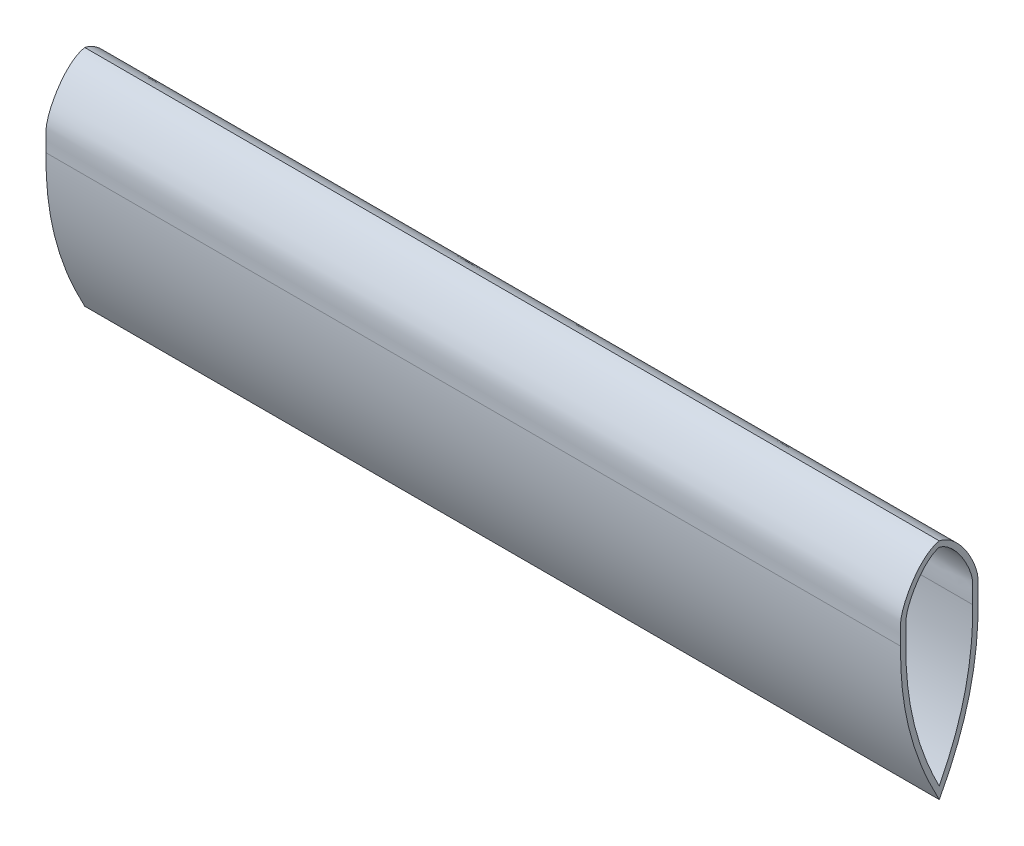
ISO-10303-21;
HEADER;
FILE_DESCRIPTION(('STEP AP214'),'2;1');
FILE_NAME('part.step','',(''),(''),'','','');
FILE_SCHEMA(('AUTOMOTIVE_DESIGN { 1 0 10303 214 1 1 1 1 }'));
ENDSEC;
DATA;
#1=APPLICATION_CONTEXT('core data for automotive mechanical design processes');
#2=APPLICATION_PROTOCOL_DEFINITION('international standard','automotive_design',2000,#1);
#3=PRODUCT_CONTEXT('',#1,'mechanical');
#4=PRODUCT('Part','Part','',(#3));
#5=PRODUCT_RELATED_PRODUCT_CATEGORY('part','',(#4));
#6=PRODUCT_DEFINITION_FORMATION('','',#4);
#7=PRODUCT_DEFINITION_CONTEXT('part definition',#1,'design');
#8=PRODUCT_DEFINITION('design','',#6,#7);
#9=PRODUCT_DEFINITION_SHAPE('','',#8);
#10=(LENGTH_UNIT() NAMED_UNIT(*) SI_UNIT(.MILLI.,.METRE.));
#11=(NAMED_UNIT(*) PLANE_ANGLE_UNIT() SI_UNIT($,.RADIAN.));
#12=(NAMED_UNIT(*) SI_UNIT($,.STERADIAN.) SOLID_ANGLE_UNIT());
#13=UNCERTAINTY_MEASURE_WITH_UNIT(LENGTH_MEASURE(1.E-05),#10,'distance_accuracy_value','');
#14=(GEOMETRIC_REPRESENTATION_CONTEXT(3) GLOBAL_UNCERTAINTY_ASSIGNED_CONTEXT((#13)) GLOBAL_UNIT_ASSIGNED_CONTEXT((#10,
#11,#12)) REPRESENTATION_CONTEXT('',''));
#15=CARTESIAN_POINT('',(0.,0.,0.));
#16=DIRECTION('',(0.,0.,1.));
#17=DIRECTION('',(1.,0.,0.));
#18=AXIS2_PLACEMENT_3D('',#15,#16,#17);
#19=CARTESIAN_POINT('',(-49.5800401380547,0.137883897239489,9.2071561492045));
#20=CARTESIAN_POINT('',(-49.5800401380547,-3.01606196797375,9.25456787896486));
#21=CARTESIAN_POINT('',(-49.5800401380547,-6.16264361898918,9.11059405651137));
#22=CARTESIAN_POINT('',(-49.5800401380547,-10.8626435189926,8.56973641400696));
#23=CARTESIAN_POINT('',(-49.5800401380547,-12.4197520761779,8.33627501275813));
#24=CARTESIAN_POINT('',(-49.5800401380547,-15.5145608051524,7.76137535616036));
#25=CARTESIAN_POINT('',(-49.5800401380547,-17.0536244353491,7.41957392528804));
#26=CARTESIAN_POINT('',(-49.5800401380547,-21.6326214974825,6.23425482299187));
#27=CARTESIAN_POINT('',(-49.5800401380547,-24.6188921134478,5.23448895790812));
#28=CARTESIAN_POINT('',(-49.5800401380547,-29.000286622128,3.4510716821276));
#29=CARTESIAN_POINT('',(-49.5800401380547,-30.4395127371933,2.81154025811644));
#30=CARTESIAN_POINT('',(-49.5800401380547,-32.5691461752788,1.79028170997374));
#31=CARTESIAN_POINT('',(-49.5800401380547,-33.2737495180574,1.43867214479024));
#32=CARTESIAN_POINT('',(-49.5800401380547,-34.675359425009,0.719336072395409));
#33=CARTESIAN_POINT('',(-49.5800401380547,-35.3761643784848,0.359668036197995));
#34=CARTESIAN_POINT('',(-49.5800401380547,-36.0769693319606,5.77711911499676E-13));
#35=B_SPLINE_CURVE_WITH_KNOTS('',3,(#19,#20,#21,#22,#23,#24,#25,#26,#27,#28,#29,#30,#31,#32,#33,
#34),.UNSPECIFIED.,.F.,.F.,(4,2,2,2,2,2,2,4),(0.,0.25,0.375,0.5,0.75,0.875,0.9375,1.),.UNSPECIFIED.);
#36=DIRECTION('',(1.,0.,0.));
#37=VECTOR('',#36,1.);
#38=SURFACE_OF_LINEAR_EXTRUSION('',#35,#37);
#39=CARTESIAN_POINT('',(153.619959861945,0.137883897239494,9.20715614920447));
#40=CARTESIAN_POINT('',(153.619959861945,-3.01606196797375,9.25456787896483));
#41=CARTESIAN_POINT('',(153.619959861945,-6.16264361898918,9.11059405651134));
#42=CARTESIAN_POINT('',(153.619959861945,-10.8626435189926,8.56973641400693));
#43=CARTESIAN_POINT('',(153.619959861945,-12.4197520761779,8.3362750127581));
#44=CARTESIAN_POINT('',(153.619959861945,-15.5145608051524,7.76137535616033));
#45=CARTESIAN_POINT('',(153.619959861945,-17.0536244353491,7.41957392528801));
#46=CARTESIAN_POINT('',(153.619959861945,-21.6326214974825,6.23425482299184));
#47=CARTESIAN_POINT('',(153.619959861945,-24.6188921134478,5.23448895790809));
#48=CARTESIAN_POINT('',(153.619959861945,-29.000286622128,3.45107168212757));
#49=CARTESIAN_POINT('',(153.619959861945,-30.4395127371933,2.81154025811641));
#50=CARTESIAN_POINT('',(153.619959861945,-32.5691461752788,1.79028170997371));
#51=CARTESIAN_POINT('',(153.619959861945,-33.2737495180574,1.43867214479021));
#52=CARTESIAN_POINT('',(153.619959861945,-34.675359425009,0.719336072395378));
#53=CARTESIAN_POINT('',(153.619959861945,-35.3761643784848,0.359668036197964));
#54=CARTESIAN_POINT('',(153.619959861945,-36.0769693319606,5.46692280191649E-13));
#55=B_SPLINE_CURVE_WITH_KNOTS('',3,(#39,#40,#41,#42,#43,#44,#45,#46,#47,#48,#49,#50,#51,#52,#53,
#54),.UNSPECIFIED.,.F.,.F.,(4,2,2,2,2,2,2,4),(0.,0.25,0.375,0.5,0.75,0.875,0.9375,1.),.UNSPECIFIED.);
#56=CARTESIAN_POINT('',(153.619959861945,0.137883897239494,9.20715614920447));
#57=VERTEX_POINT('',#56);
#58=CARTESIAN_POINT('',(153.619959861945,-36.0769693319606,5.50525672847727E-13));
#59=VERTEX_POINT('',#58);
#60=EDGE_CURVE('E230',#57,#59,#55,.T.);
#61=ORIENTED_EDGE('',*,*,#60,.F.);
#62=DIRECTION('',(1.,0.,0.));
#63=VECTOR('',#62,1.);
#64=CARTESIAN_POINT('',(-49.5800401380547,0.137883897239489,9.2071561492045));
#65=LINE('',#64,#63);
#66=CARTESIAN_POINT('',(-49.5800401380547,0.137883897239489,9.2071561492045));
#67=VERTEX_POINT('',#66);
#68=EDGE_CURVE('E13',#67,#57,#65,.T.);
#69=ORIENTED_EDGE('',*,*,#68,.F.);
#70=CARTESIAN_POINT('',(-49.5800401380547,-36.0769693319606,5.81545304155753E-13));
#71=VERTEX_POINT('',#70);
#72=EDGE_CURVE('E262',#67,#71,#35,.T.);
#73=ORIENTED_EDGE('',*,*,#72,.T.);
#74=DIRECTION('',(1.,0.,0.));
#75=VECTOR('',#74,1.);
#76=CARTESIAN_POINT('',(-49.5800401380547,-36.0769693319606,5.81545304155753E-13));
#77=LINE('',#76,#75);
#78=EDGE_CURVE('E104',#71,#59,#77,.T.);
#79=ORIENTED_EDGE('',*,*,#78,.T.);
#80=EDGE_LOOP('',(#61,#69,#73,#79));
#81=FACE_BOUND('',#80,.T.);
#82=ADVANCED_FACE('F100',(#81),#38,.T.);
#83=CARTESIAN_POINT('',(-49.5800401380547,17.2075595458434,-1.2389083937194E-13));
#84=CARTESIAN_POINT('',(-49.5800401380547,17.152862003518,0.213797016089813));
#85=CARTESIAN_POINT('',(-49.5800401380547,17.1008018026928,0.428807060053303));
#86=CARTESIAN_POINT('',(-49.5800401380547,16.968003101158,0.845636752605621));
#87=CARTESIAN_POINT('',(-49.5800401380547,16.8906257748625,1.0490023512551));
#88=CARTESIAN_POINT('',(-49.5800401380547,16.6301036989386,1.64604130883248));
#89=CARTESIAN_POINT('',(-49.5800401380547,16.4187878443371,2.0267575533487));
#90=CARTESIAN_POINT('',(-49.5800401380547,16.0576102713675,2.5775006772116));
#91=CARTESIAN_POINT('',(-49.5800401380547,15.9292642493959,2.75829823647497));
#92=CARTESIAN_POINT('',(-49.5800401380547,15.6629438036593,3.10889431206567));
#93=CARTESIAN_POINT('',(-49.5800401380547,15.5247615889203,3.27912106073905));
#94=CARTESIAN_POINT('',(-49.5800401380547,15.0972727059457,3.77673202343137));
#95=CARTESIAN_POINT('',(-49.5800401380547,14.7951379775308,4.09116225350928));
#96=CARTESIAN_POINT('',(-49.5800401380547,14.1639827018088,4.69287297619109));
#97=CARTESIAN_POINT('',(-49.5800401380547,13.8349056444013,4.98009640397594));
#98=CARTESIAN_POINT('',(-49.5800401380547,13.1540037508977,5.53157218241405));
#99=CARTESIAN_POINT('',(-49.5800401380547,12.8012958221803,5.79630297980034));
#100=CARTESIAN_POINT('',(-49.5800401380547,11.72685146721,6.54982361859318));
#101=CARTESIAN_POINT('',(-49.5800401380547,10.9851579008631,7.00253711647313));
#102=CARTESIAN_POINT('',(-49.5800401380547,9.45595006176671,7.81841743961159));
#103=CARTESIAN_POINT('',(-49.5800401380547,8.66888333909439,8.18245890481772));
#104=CARTESIAN_POINT('',(-49.5800401380547,7.44317737584387,8.6403714052763));
#105=CARTESIAN_POINT('',(-49.5800401380547,7.02559682181268,8.77848875807363));
#106=CARTESIAN_POINT('',(-49.5800401380547,6.17382792871073,9.00908377803585));
#107=CARTESIAN_POINT('',(-49.5800401380547,5.74668263162353,9.10010942656311));
#108=CARTESIAN_POINT('',(-49.5800401380547,4.88832003713866,9.20377313957197));
#109=CARTESIAN_POINT('',(-49.5800401380547,4.45686279805711,9.21179223365171));
#110=CARTESIAN_POINT('',(-49.5800401380547,3.59244839685004,9.19895632193277));
#111=CARTESIAN_POINT('',(-49.5800401380547,3.16006289280662,9.1891059557558));
#112=CARTESIAN_POINT('',(-49.5800401380547,1.86356590848878,9.1722510232075));
#113=CARTESIAN_POINT('',(-49.5800401380547,1.0000174348415,9.17608455259727));
#114=CARTESIAN_POINT('',(-49.5800401380547,0.137883897239483,9.2071561492045));
#115=B_SPLINE_CURVE_WITH_KNOTS('',3,(#83,#84,#85,#86,#87,#88,#89,#90,#91,#92,#93,#94,#95,#96,
#97,#98,#99,#100,#101,#102,#103,#104,#105,#106,#107,#108,#109,#110,#111,#112,#113,#114),
.UNSPECIFIED.,.F.,.F.,(4,2,2,2,2,2,2,2,2,2,2,2,2,2,2,4),(0.,0.0312500000000003,
0.0625000000000005,0.125000000000001,0.156250000000001,0.187500000000001,0.250000000000002,
0.312500000000002,0.375000000000002,0.500000000000001,0.625000000000001,0.687500000000001,
0.750000000000001,0.812500000000001,0.875000000000001,1.),.UNSPECIFIED.);
#116=DIRECTION('',(1.,0.,0.));
#117=VECTOR('',#116,1.);
#118=SURFACE_OF_LINEAR_EXTRUSION('',#115,#117);
#119=CARTESIAN_POINT('',(153.619959861945,17.2075595458434,-1.54910470679967E-13));
#120=CARTESIAN_POINT('',(153.619959861945,17.152862003518,0.213797016089782));
#121=CARTESIAN_POINT('',(153.619959861945,17.1008018026928,0.428807060053272));
#122=CARTESIAN_POINT('',(153.619959861945,16.968003101158,0.84563675260559));
#123=CARTESIAN_POINT('',(153.619959861945,16.8906257748625,1.04900235125507));
#124=CARTESIAN_POINT('',(153.619959861945,16.6301036989386,1.64604130883245));
#125=CARTESIAN_POINT('',(153.619959861945,16.4187878443371,2.02675755334867));
#126=CARTESIAN_POINT('',(153.619959861945,16.0576102713675,2.57750067721157));
#127=CARTESIAN_POINT('',(153.619959861945,15.9292642493959,2.75829823647494));
#128=CARTESIAN_POINT('',(153.619959861945,15.6629438036593,3.10889431206564));
#129=CARTESIAN_POINT('',(153.619959861945,15.5247615889203,3.27912106073902));
#130=CARTESIAN_POINT('',(153.619959861945,15.0972727059457,3.77673202343134));
#131=CARTESIAN_POINT('',(153.619959861945,14.7951379775308,4.09116225350925));
#132=CARTESIAN_POINT('',(153.619959861945,14.1639827018088,4.69287297619106));
#133=CARTESIAN_POINT('',(153.619959861945,13.8349056444013,4.98009640397591));
#134=CARTESIAN_POINT('',(153.619959861945,13.1540037508977,5.53157218241402));
#135=CARTESIAN_POINT('',(153.619959861945,12.8012958221803,5.79630297980031));
#136=CARTESIAN_POINT('',(153.619959861945,11.72685146721,6.54982361859315));
#137=CARTESIAN_POINT('',(153.619959861945,10.9851579008631,7.0025371164731));
#138=CARTESIAN_POINT('',(153.619959861945,9.45595006176672,7.81841743961156));
#139=CARTESIAN_POINT('',(153.619959861945,8.6688833390944,8.18245890481769));
#140=CARTESIAN_POINT('',(153.619959861945,7.44317737584388,8.64037140527627));
#141=CARTESIAN_POINT('',(153.619959861945,7.02559682181269,8.7784887580736));
#142=CARTESIAN_POINT('',(153.619959861945,6.17382792871074,9.00908377803582));
#143=CARTESIAN_POINT('',(153.619959861945,5.74668263162353,9.10010942656307));
#144=CARTESIAN_POINT('',(153.619959861945,4.88832003713866,9.20377313957194));
#145=CARTESIAN_POINT('',(153.619959861945,4.45686279805711,9.21179223365168));
#146=CARTESIAN_POINT('',(153.619959861945,3.59244839685005,9.19895632193274));
#147=CARTESIAN_POINT('',(153.619959861945,3.16006289280662,9.18910595575577));
#148=CARTESIAN_POINT('',(153.619959861945,1.86356590848879,9.17225102320747));
#149=CARTESIAN_POINT('',(153.619959861945,1.00001743484151,9.17608455259724));
#150=CARTESIAN_POINT('',(153.619959861945,0.137883897239487,9.20715614920447));
#151=B_SPLINE_CURVE_WITH_KNOTS('',3,(#119,#120,#121,#122,#123,#124,#125,#126,#127,#128,#129,
#130,#131,#132,#133,#134,#135,#136,#137,#138,#139,#140,#141,#142,#143,#144,#145,#146,#147,#148,
#149,#150),.UNSPECIFIED.,.F.,.F.,(4,2,2,2,2,2,2,2,2,2,2,2,2,2,2,4),(0.,0.0312500000000003,
0.0625000000000005,0.125000000000001,0.156250000000001,0.187500000000001,0.250000000000002,
0.312500000000002,0.375000000000002,0.500000000000001,0.625000000000001,0.687500000000001,
0.750000000000001,0.812500000000001,0.875000000000001,1.),.UNSPECIFIED.);
#152=CARTESIAN_POINT('',(153.619959861945,17.2075595458434,-1.54910470679967E-13));
#153=VERTEX_POINT('',#152);
#154=EDGE_CURVE('E255',#153,#57,#151,.T.);
#155=ORIENTED_EDGE('',*,*,#154,.F.);
#156=DIRECTION('',(1.,0.,0.));
#157=VECTOR('',#156,1.);
#158=CARTESIAN_POINT('',(-49.5800401380547,17.2075595458434,-1.2389083937194E-13));
#159=LINE('',#158,#157);
#160=CARTESIAN_POINT('',(-49.5800401380547,17.2075595458434,-1.2389083937194E-13));
#161=VERTEX_POINT('',#160);
#162=EDGE_CURVE('E109',#161,#153,#159,.T.);
#163=ORIENTED_EDGE('',*,*,#162,.F.);
#164=EDGE_CURVE('E219',#161,#67,#115,.T.);
#165=ORIENTED_EDGE('',*,*,#164,.T.);
#166=ORIENTED_EDGE('',*,*,#68,.T.);
#167=EDGE_LOOP('',(#155,#163,#165,#166));
#168=FACE_BOUND('',#167,.T.);
#169=ADVANCED_FACE('F212',(#168),#118,.T.);
#170=CARTESIAN_POINT('',(-49.5800401380547,0.137883897239551,-9.20715614920431));
#171=CARTESIAN_POINT('',(-49.5800401380547,1.01097950046926,-9.1756894758876));
#172=CARTESIAN_POINT('',(-49.5800401380547,1.88459061875845,-9.17223382694282));
#173=CARTESIAN_POINT('',(-49.5800401380547,3.19542448510586,-9.18971872879821));
#174=CARTESIAN_POINT('',(-49.5800401380547,3.63245517778549,-9.2002237592524));
#175=CARTESIAN_POINT('',(-49.5800401380547,4.50634263954291,-9.2117835079781));
#176=CARTESIAN_POINT('',(-49.5800401380547,4.9429760607557,-9.20070239747962));
#177=CARTESIAN_POINT('',(-49.5800401380547,5.59667435096606,-9.11606067068694));
#178=CARTESIAN_POINT('',(-49.5800401380547,5.81462109422092,-9.0775456326116));
#179=CARTESIAN_POINT('',(-49.5800401380547,6.24269846558627,-8.98673912995034));
#180=CARTESIAN_POINT('',(-49.5800401380547,6.45396792893945,-8.93429324667075));
#181=CARTESIAN_POINT('',(-49.5800401380547,7.08139166700476,-8.76071827502867));
#182=CARTESIAN_POINT('',(-49.5800401380547,7.49126650773411,-8.62361945324545));
#183=CARTESIAN_POINT('',(-49.5800401380547,8.70308767266459,-8.16704583868329));
#184=CARTESIAN_POINT('',(-49.5800401380547,9.48758834313931,-7.80320360130294));
#185=CARTESIAN_POINT('',(-49.5800401380547,10.6368344023847,-7.18749020450805));
#186=CARTESIAN_POINT('',(-49.5800401380547,11.016052248185,-6.96955373944425));
#187=CARTESIAN_POINT('',(-49.5800401380547,11.7571633375627,-6.51357123522543));
#188=CARTESIAN_POINT('',(-49.5800401380547,12.1197433055041,-6.2752236578263));
#189=CARTESIAN_POINT('',(-49.5800401380547,13.1821062796736,-5.52722885875329));
#190=CARTESIAN_POINT('',(-49.5800401380547,13.857489095203,-4.9858978704995));
#191=CARTESIAN_POINT('',(-49.5800401380547,14.801700924238,-4.08448323345076));
#192=CARTESIAN_POINT('',(-49.5800401380547,15.1060830104655,-3.76712043798505));
#193=CARTESIAN_POINT('',(-49.5800401380547,15.6732894052015,-3.10556890090345));
#194=CARTESIAN_POINT('',(-49.5800401380547,15.9370992929062,-2.76082512459062));
#195=CARTESIAN_POINT('',(-49.5800401380547,16.2944201449862,-2.21661508263391));
#196=CARTESIAN_POINT('',(-49.5800401380547,16.4070856093444,-2.03066602099406));
#197=CARTESIAN_POINT('',(-49.5800401380547,16.6173432619878,-1.64813078644209));
#198=CARTESIAN_POINT('',(-49.5800401380547,16.7153289053561,-1.4506119411306));
#199=CARTESIAN_POINT('',(-49.5800401380547,16.8910759065517,-1.04808859285836));
#200=CARTESIAN_POINT('',(-49.5800401380547,16.9688185093228,-0.843382437491581));
#201=CARTESIAN_POINT('',(-49.5800401380547,17.1015258658926,-0.426225712136229));
#202=CARTESIAN_POINT('',(-49.5800401380547,17.153157527226,-0.212641898615526));
#203=CARTESIAN_POINT('',(-49.5800401380547,17.2075595458434,-1.2389083937194E-13));
#204=B_SPLINE_CURVE_WITH_KNOTS('',3,(#170,#171,#172,#173,#174,#175,#176,#177,#178,#179,#180,
#181,#182,#183,#184,#185,#186,#187,#188,#189,#190,#191,#192,#193,#194,#195,#196,#197,#198,#199,
#200,#201,#202,#203),.UNSPECIFIED.,.F.,.F.,(4,2,2,2,2,2,2,2,2,2,2,2,2,2,2,2,4),(0.,
0.125000000000001,0.187500000000001,0.250000000000001,0.281250000000001,0.312500000000001,
0.375000000000001,0.500000000000001,0.562500000000001,0.625000000000001,0.750000000000001,
0.812500000000001,0.875,0.90625,0.9375,0.96875,1.),.UNSPECIFIED.);
#205=DIRECTION('',(1.,0.,0.));
#206=VECTOR('',#205,1.);
#207=SURFACE_OF_LINEAR_EXTRUSION('',#204,#206);
#208=CARTESIAN_POINT('',(153.619959861945,0.137883897239556,-9.20715614920434));
#209=CARTESIAN_POINT('',(153.619959861945,1.01097950046926,-9.17568947588763));
#210=CARTESIAN_POINT('',(153.619959861945,1.88459061875845,-9.17223382694285));
#211=CARTESIAN_POINT('',(153.619959861945,3.19542448510587,-9.18971872879824));
#212=CARTESIAN_POINT('',(153.619959861945,3.6324551777855,-9.20022375925243));
#213=CARTESIAN_POINT('',(153.619959861945,4.50634263954291,-9.21178350797813));
#214=CARTESIAN_POINT('',(153.619959861945,4.9429760607557,-9.20070239747965));
#215=CARTESIAN_POINT('',(153.619959861945,5.59667435096606,-9.11606067068697));
#216=CARTESIAN_POINT('',(153.619959861945,5.81462109422092,-9.07754563261163));
#217=CARTESIAN_POINT('',(153.619959861945,6.24269846558628,-8.98673912995038));
#218=CARTESIAN_POINT('',(153.619959861945,6.45396792893945,-8.93429324667078));
#219=CARTESIAN_POINT('',(153.619959861945,7.08139166700476,-8.7607182750287));
#220=CARTESIAN_POINT('',(153.619959861945,7.49126650773412,-8.62361945324548));
#221=CARTESIAN_POINT('',(153.619959861945,8.70308767266459,-8.16704583868332));
#222=CARTESIAN_POINT('',(153.619959861945,9.48758834313931,-7.80320360130297));
#223=CARTESIAN_POINT('',(153.619959861945,10.6368344023847,-7.18749020450808));
#224=CARTESIAN_POINT('',(153.619959861945,11.016052248185,-6.96955373944428));
#225=CARTESIAN_POINT('',(153.619959861945,11.7571633375627,-6.51357123522547));
#226=CARTESIAN_POINT('',(153.619959861945,12.1197433055041,-6.27522365782633));
#227=CARTESIAN_POINT('',(153.619959861945,13.1821062796737,-5.52722885875332));
#228=CARTESIAN_POINT('',(153.619959861945,13.857489095203,-4.98589787049953));
#229=CARTESIAN_POINT('',(153.619959861945,14.801700924238,-4.08448323345079));
#230=CARTESIAN_POINT('',(153.619959861945,15.1060830104656,-3.76712043798508));
#231=CARTESIAN_POINT('',(153.619959861945,15.6732894052015,-3.10556890090348));
#232=CARTESIAN_POINT('',(153.619959861945,15.9370992929062,-2.76082512459065));
#233=CARTESIAN_POINT('',(153.619959861945,16.2944201449862,-2.21661508263394));
#234=CARTESIAN_POINT('',(153.619959861945,16.4070856093444,-2.03066602099409));
#235=CARTESIAN_POINT('',(153.619959861945,16.6173432619878,-1.64813078644212));
#236=CARTESIAN_POINT('',(153.619959861945,16.7153289053561,-1.45061194113063));
#237=CARTESIAN_POINT('',(153.619959861945,16.8910759065517,-1.04808859285839));
#238=CARTESIAN_POINT('',(153.619959861945,16.9688185093228,-0.843382437491612));
#239=CARTESIAN_POINT('',(153.619959861945,17.1015258658926,-0.42622571213626));
#240=CARTESIAN_POINT('',(153.619959861945,17.153157527226,-0.212641898615557));
#241=CARTESIAN_POINT('',(153.619959861945,17.2075595458434,-1.54910470679967E-13));
#242=B_SPLINE_CURVE_WITH_KNOTS('',3,(#208,#209,#210,#211,#212,#213,#214,#215,#216,#217,#218,
#219,#220,#221,#222,#223,#224,#225,#226,#227,#228,#229,#230,#231,#232,#233,#234,#235,#236,#237,
#238,#239,#240,#241),.UNSPECIFIED.,.F.,.F.,(4,2,2,2,2,2,2,2,2,2,2,2,2,2,2,2,4),(0.,
0.125000000000001,0.187500000000001,0.250000000000001,0.281250000000001,0.312500000000001,
0.375000000000001,0.500000000000001,0.562500000000001,0.625000000000001,0.750000000000001,
0.812500000000001,0.875,0.90625,0.9375,0.96875,1.),.UNSPECIFIED.);
#243=CARTESIAN_POINT('',(153.619959861945,0.137883897239556,-9.20715614920434));
#244=VERTEX_POINT('',#243);
#245=EDGE_CURVE('E247',#244,#153,#242,.T.);
#246=ORIENTED_EDGE('',*,*,#245,.F.);
#247=DIRECTION('',(1.,0.,0.));
#248=VECTOR('',#247,1.);
#249=CARTESIAN_POINT('',(-49.5800401380547,0.137883897239551,-9.20715614920431));
#250=LINE('',#249,#248);
#251=CARTESIAN_POINT('',(-49.5800401380547,0.137883897239551,-9.20715614920431));
#252=VERTEX_POINT('',#251);
#253=EDGE_CURVE('E267',#252,#244,#250,.T.);
#254=ORIENTED_EDGE('',*,*,#253,.F.);
#255=EDGE_CURVE('E225',#252,#161,#204,.T.);
#256=ORIENTED_EDGE('',*,*,#255,.T.);
#257=ORIENTED_EDGE('',*,*,#162,.T.);
#258=EDGE_LOOP('',(#246,#254,#256,#257));
#259=FACE_BOUND('',#258,.T.);
#260=ADVANCED_FACE('F216',(#259),#207,.T.);
#261=CARTESIAN_POINT('',(-49.5800401380547,-36.0769693319606,5.81545304155753E-13));
#262=CARTESIAN_POINT('',(-49.5800401380547,-35.3760563629066,-0.359723472093385));
#263=CARTESIAN_POINT('',(-49.5800401380547,-34.6751433938526,-0.719446944187347));
#264=CARTESIAN_POINT('',(-49.5800401380547,-33.2733174557445,-1.43889388837528));
#265=CARTESIAN_POINT('',(-49.5800401380547,-32.5685724441238,-1.79056585666954));
#266=CARTESIAN_POINT('',(-49.5800401380547,-30.4383845569298,-2.81206322700429));
#267=CARTESIAN_POINT('',(-49.5800401380547,-28.9980258392256,-3.45204899547126));
#268=CARTESIAN_POINT('',(-49.5800401380547,-26.0769569243323,-4.64093627892345));
#269=CARTESIAN_POINT('',(-49.5800401380547,-24.6004101183921,-5.18815568995378));
#270=CARTESIAN_POINT('',(-49.5800401380547,-21.6134932528625,-6.18284167851509));
#271=CARTESIAN_POINT('',(-49.5800401380547,-20.1017186473143,-6.63065634423914));
#272=CARTESIAN_POINT('',(-49.5800401380547,-15.5227754494136,-7.81562489543863));
#273=CARTESIAN_POINT('',(-49.5800401380547,-12.426265441413,-8.38992897514502));
#274=CARTESIAN_POINT('',(-49.5800401380547,-6.16013436464744,-9.11075462961601));
#275=CARTESIAN_POINT('',(-49.5800401380547,-3.01600779191244,-9.25456706456239));
#276=CARTESIAN_POINT('',(-49.5800401380547,0.137883897239556,-9.20715614920431));
#277=B_SPLINE_CURVE_WITH_KNOTS('',3,(#261,#262,#263,#264,#265,#266,#267,#268,#269,#270,#271,
#272,#273,#274,#275,#276),.UNSPECIFIED.,.F.,.F.,(4,2,2,2,2,2,2,4),(0.,0.0625,0.125,0.25,0.375,
0.5,0.75,1.),.UNSPECIFIED.);
#278=DIRECTION('',(1.,0.,0.));
#279=VECTOR('',#278,1.);
#280=SURFACE_OF_LINEAR_EXTRUSION('',#277,#279);
#281=CARTESIAN_POINT('',(153.619959861945,-36.0769693319606,5.50525672847727E-13));
#282=CARTESIAN_POINT('',(153.619959861945,-35.3760563629066,-0.359723472093416));
#283=CARTESIAN_POINT('',(153.619959861945,-34.6751433938526,-0.719446944187378));
#284=CARTESIAN_POINT('',(153.619959861945,-33.2733174557445,-1.43889388837531));
#285=CARTESIAN_POINT('',(153.619959861945,-32.5685724441238,-1.79056585666957));
#286=CARTESIAN_POINT('',(153.619959861945,-30.4383845569298,-2.81206322700432));
#287=CARTESIAN_POINT('',(153.619959861945,-28.9980258392256,-3.45204899547129));
#288=CARTESIAN_POINT('',(153.619959861945,-26.0769569243323,-4.64093627892349));
#289=CARTESIAN_POINT('',(153.619959861945,-24.6004101183921,-5.18815568995381));
#290=CARTESIAN_POINT('',(153.619959861945,-21.6134932528625,-6.18284167851512));
#291=CARTESIAN_POINT('',(153.619959861945,-20.1017186473143,-6.63065634423917));
#292=CARTESIAN_POINT('',(153.619959861945,-15.5227754494136,-7.81562489543867));
#293=CARTESIAN_POINT('',(153.619959861945,-12.426265441413,-8.38992897514505));
#294=CARTESIAN_POINT('',(153.619959861945,-6.16013436464743,-9.11075462961604));
#295=CARTESIAN_POINT('',(153.619959861945,-3.01600779191243,-9.25456706456242));
#296=CARTESIAN_POINT('',(153.619959861945,0.13788389723956,-9.20715614920434));
#297=B_SPLINE_CURVE_WITH_KNOTS('',3,(#281,#282,#283,#284,#285,#286,#287,#288,#289,#290,#291,
#292,#293,#294,#295,#296),.UNSPECIFIED.,.F.,.F.,(4,2,2,2,2,2,2,4),(0.,0.0625,0.125,0.25,0.375,
0.5,0.75,1.),.UNSPECIFIED.);
#298=EDGE_CURVE('E238',#59,#244,#297,.T.);
#299=ORIENTED_EDGE('',*,*,#298,.F.);
#300=ORIENTED_EDGE('',*,*,#78,.F.);
#301=EDGE_CURVE('E282',#71,#252,#277,.T.);
#302=ORIENTED_EDGE('',*,*,#301,.T.);
#303=ORIENTED_EDGE('',*,*,#253,.T.);
#304=EDGE_LOOP('',(#299,#300,#302,#303));
#305=FACE_BOUND('',#304,.T.);
#306=ADVANCED_FACE('F208',(#305),#280,.T.);
#307=CARTESIAN_POINT('',(-49.5800401380547,-18.5799567893935,7.02446755785598));
#308=DIRECTION('',(-1.,0.,0.));
#309=DIRECTION('',(0.,0.,1.));
#310=AXIS2_PLACEMENT_3D('',#307,#308,#309);
#311=PLANE('',#310);
#312=CARTESIAN_POINT('',(-49.5800401380547,0.105464983381302,7.93749999999993));
#313=CARTESIAN_POINT('',(-49.5800401380547,-11.8752758390628,8.11760063281918));
#314=CARTESIAN_POINT('',(-49.5800401380547,-22.6445933827702,5.4662902168432));
#315=CARTESIAN_POINT('',(-49.5800401380547,-33.2955350166187,5.67410018331974E-13));
#316=B_SPLINE_CURVE_WITH_KNOTS('',3,(#312,#313,#314,#315),.UNSPECIFIED.,.F.,.F.,(4,4),(0.,1.),.UNSPECIFIED.);
#317=CARTESIAN_POINT('',(-49.5800401380547,0.105464983381302,7.93749999999993));
#318=VERTEX_POINT('',#317);
#319=CARTESIAN_POINT('',(-49.5800401380547,-33.2955350166187,5.67410018331974E-13));
#320=VERTEX_POINT('',#319);
#321=EDGE_CURVE('E168',#318,#320,#316,.T.);
#322=ORIENTED_EDGE('',*,*,#321,.T.);
#323=CARTESIAN_POINT('',(-49.5800401380547,-33.2955350166187,5.67410018331974E-13));
#324=CARTESIAN_POINT('',(-49.5800401380547,-22.6445933827707,-5.46629021684193));
#325=CARTESIAN_POINT('',(-49.5800401380547,-11.8752758390628,-8.11760063281908));
#326=CARTESIAN_POINT('',(-49.5800401380547,0.105464983381357,-7.93749999999974));
#327=B_SPLINE_CURVE_WITH_KNOTS('',3,(#323,#324,#325,#326),.UNSPECIFIED.,.F.,.F.,(4,4),(0.,1.),.UNSPECIFIED.);
#328=CARTESIAN_POINT('',(-49.5800401380547,0.105464983381357,-7.93749999999974));
#329=VERTEX_POINT('',#328);
#330=EDGE_CURVE('E177',#320,#329,#327,.T.);
#331=ORIENTED_EDGE('',*,*,#330,.T.);
#332=CARTESIAN_POINT('',(-49.5800401380547,0.105464983381357,-7.93749999999974));
#333=CARTESIAN_POINT('',(-49.5800401380547,1.57565461459209,-7.88451384743203));
#334=CARTESIAN_POINT('',(-49.5800401380547,3.33473819030077,-7.92593053810745));
#335=CARTESIAN_POINT('',(-49.5800401380547,7.54708300187666,-7.98902906903362));
#336=CARTESIAN_POINT('',(-49.5800401380547,14.9234073115813,-3.80414762291369));
#337=CARTESIAN_POINT('',(-49.5800401380547,15.8966553457297,0.));
#338=B_SPLINE_CURVE_WITH_KNOTS('',3,(#332,#333,#334,#335,#336,#337),.UNSPECIFIED.,.F.,.F.,(4,1,
1,4),(0.,0.236691734828959,0.336691734828958,1.),.UNSPECIFIED.);
#339=CARTESIAN_POINT('',(-49.5800401380547,15.8966553457297,-1.67073521694234E-13));
#340=VERTEX_POINT('',#339);
#341=EDGE_CURVE('E117',#329,#340,#338,.T.);
#342=ORIENTED_EDGE('',*,*,#341,.T.);
#343=CARTESIAN_POINT('',(-49.5800401380547,15.8966553457297,-1.67073521694234E-13));
#344=CARTESIAN_POINT('',(-49.5800401380547,14.9234073115812,3.80414762291342));
#345=CARTESIAN_POINT('',(-49.5800401380547,7.54708300187675,7.9890290690338));
#346=CARTESIAN_POINT('',(-49.5800401380547,3.33473819030105,7.9259305381075));
#347=CARTESIAN_POINT('',(-49.5800401380547,1.57565461459204,7.88451384743223));
#348=CARTESIAN_POINT('',(-49.5800401380547,0.105464983381302,7.93749999999993));
#349=B_SPLINE_CURVE_WITH_KNOTS('',3,(#343,#344,#345,#346,#347,#348),.UNSPECIFIED.,.F.,.F.,(4,1,
1,4),(0.,0.663308265171042,0.763308265171041,1.),.UNSPECIFIED.);
#350=EDGE_CURVE('E174',#340,#318,#349,.T.);
#351=ORIENTED_EDGE('',*,*,#350,.T.);
#352=EDGE_LOOP('',(#322,#331,#342,#351));
#353=FACE_BOUND('',#352,.T.);
#354=ORIENTED_EDGE('',*,*,#72,.F.);
#355=ORIENTED_EDGE('',*,*,#164,.F.);
#356=ORIENTED_EDGE('',*,*,#255,.F.);
#357=ORIENTED_EDGE('',*,*,#301,.F.);
#358=EDGE_LOOP('',(#354,#355,#356,#357));
#359=FACE_BOUND('',#358,.T.);
#360=ADVANCED_FACE('F181',(#353,#359),#311,.T.);
#361=CARTESIAN_POINT('',(153.619959861945,-18.5799567893935,7.02446755785595));
#362=DIRECTION('',(-1.,0.,0.));
#363=DIRECTION('',(0.,0.,1.));
#364=AXIS2_PLACEMENT_3D('',#361,#362,#363);
#365=PLANE('',#364);
#366=CARTESIAN_POINT('',(153.619959861945,-33.2955350166187,5.36390387023947E-13));
#367=CARTESIAN_POINT('',(153.619959861945,-22.6445933827707,-5.46629021684196));
#368=CARTESIAN_POINT('',(153.619959861945,-11.8752758390628,-8.11760063281911));
#369=CARTESIAN_POINT('',(153.619959861945,0.105464983381362,-7.93749999999977));
#370=B_SPLINE_CURVE_WITH_KNOTS('',3,(#366,#367,#368,#369),.UNSPECIFIED.,.F.,.F.,(4,4),(0.,1.),.UNSPECIFIED.);
#371=CARTESIAN_POINT('',(153.619959861945,-33.2955350166187,5.36390387023947E-13));
#372=VERTEX_POINT('',#371);
#373=CARTESIAN_POINT('',(153.619959861945,0.105464983381362,-7.93749999999977));
#374=VERTEX_POINT('',#373);
#375=EDGE_CURVE('E380',#372,#374,#370,.T.);
#376=ORIENTED_EDGE('',*,*,#375,.F.);
#377=CARTESIAN_POINT('',(153.619959861945,0.105464983381306,7.9374999999999));
#378=CARTESIAN_POINT('',(153.619959861945,-11.8752758390628,8.11760063281915));
#379=CARTESIAN_POINT('',(153.619959861945,-22.6445933827702,5.46629021684317));
#380=CARTESIAN_POINT('',(153.619959861945,-33.2955350166187,5.36390387023947E-13));
#381=B_SPLINE_CURVE_WITH_KNOTS('',3,(#377,#378,#379,#380),.UNSPECIFIED.,.F.,.F.,(4,4),(0.,1.),.UNSPECIFIED.);
#382=CARTESIAN_POINT('',(153.619959861945,0.105464983381306,7.9374999999999));
#383=VERTEX_POINT('',#382);
#384=EDGE_CURVE('E125',#383,#372,#381,.T.);
#385=ORIENTED_EDGE('',*,*,#384,.F.);
#386=CARTESIAN_POINT('',(153.619959861945,15.8966553457297,-1.98093153002261E-13));
#387=CARTESIAN_POINT('',(153.619959861945,14.9234073115812,3.80414762291339));
#388=CARTESIAN_POINT('',(153.619959861945,7.54708300187675,7.98902906903377));
#389=CARTESIAN_POINT('',(153.619959861945,3.33473819030106,7.92593053810747));
#390=CARTESIAN_POINT('',(153.619959861945,1.57565461459204,7.8845138474322));
#391=CARTESIAN_POINT('',(153.619959861945,0.105464983381306,7.9374999999999));
#392=B_SPLINE_CURVE_WITH_KNOTS('',3,(#386,#387,#388,#389,#390,#391),.UNSPECIFIED.,.F.,.F.,(4,1,
1,4),(0.,0.663308265171042,0.763308265171041,1.),.UNSPECIFIED.);
#393=CARTESIAN_POINT('',(153.619959861945,15.8966553457297,-1.98093153002261E-13));
#394=VERTEX_POINT('',#393);
#395=EDGE_CURVE('E184',#394,#383,#392,.T.);
#396=ORIENTED_EDGE('',*,*,#395,.F.);
#397=CARTESIAN_POINT('',(153.619959861945,0.105464983381362,-7.93749999999977));
#398=CARTESIAN_POINT('',(153.619959861945,1.5756546145921,-7.88451384743206));
#399=CARTESIAN_POINT('',(153.619959861945,3.33473819030078,-7.92593053810748));
#400=CARTESIAN_POINT('',(153.619959861945,7.54708300187667,-7.98902906903365));
#401=CARTESIAN_POINT('',(153.619959861945,14.9234073115813,-3.80414762291372));
#402=CARTESIAN_POINT('',(153.619959861945,15.8966553457297,-1.12996157734982E-13));
#403=B_SPLINE_CURVE_WITH_KNOTS('',3,(#397,#398,#399,#400,#401,#402),.UNSPECIFIED.,.F.,.F.,(4,1,
1,4),(0.,0.236691734828959,0.336691734828958,1.),.UNSPECIFIED.);
#404=EDGE_CURVE('E187',#374,#394,#403,.T.);
#405=ORIENTED_EDGE('',*,*,#404,.F.);
#406=EDGE_LOOP('',(#376,#385,#396,#405));
#407=FACE_BOUND('',#406,.T.);
#408=ORIENTED_EDGE('',*,*,#60,.T.);
#409=ORIENTED_EDGE('',*,*,#298,.T.);
#410=ORIENTED_EDGE('',*,*,#245,.T.);
#411=ORIENTED_EDGE('',*,*,#154,.T.);
#412=EDGE_LOOP('',(#408,#409,#410,#411));
#413=FACE_BOUND('',#412,.T.);
#414=ADVANCED_FACE('F204',(#407,#413),#365,.F.);
#415=DIRECTION('',(1.,0.,0.));
#416=VECTOR('',#415,1.);
#417=SURFACE_OF_LINEAR_EXTRUSION('',#316,#416);
#418=ORIENTED_EDGE('',*,*,#384,.T.);
#419=DIRECTION('',(1.,0.,0.));
#420=VECTOR('',#419,1.);
#421=CARTESIAN_POINT('',(-49.5800401380547,-33.2955350166187,5.67410018331974E-13));
#422=LINE('',#421,#420);
#423=EDGE_CURVE('E164',#320,#372,#422,.T.);
#424=ORIENTED_EDGE('',*,*,#423,.F.);
#425=ORIENTED_EDGE('',*,*,#321,.F.);
#426=DIRECTION('',(1.,0.,0.));
#427=VECTOR('',#426,1.);
#428=CARTESIAN_POINT('',(-49.5800401380547,0.105464983381302,7.93749999999993));
#429=LINE('',#428,#427);
#430=EDGE_CURVE('E239',#318,#383,#429,.T.);
#431=ORIENTED_EDGE('',*,*,#430,.T.);
#432=EDGE_LOOP('',(#418,#424,#425,#431));
#433=FACE_BOUND('',#432,.T.);
#434=ADVANCED_FACE('F166',(#433),#417,.F.);
#435=DIRECTION('',(1.,0.,0.));
#436=VECTOR('',#435,1.);
#437=SURFACE_OF_LINEAR_EXTRUSION('',#349,#436);
#438=ORIENTED_EDGE('',*,*,#395,.T.);
#439=ORIENTED_EDGE('',*,*,#430,.F.);
#440=ORIENTED_EDGE('',*,*,#350,.F.);
#441=DIRECTION('',(1.,0.,0.));
#442=VECTOR('',#441,1.);
#443=CARTESIAN_POINT('',(-49.5800401380547,15.8966553457297,-1.67073521694234E-13));
#444=LINE('',#443,#442);
#445=EDGE_CURVE('E402',#340,#394,#444,.T.);
#446=ORIENTED_EDGE('',*,*,#445,.T.);
#447=EDGE_LOOP('',(#438,#439,#440,#446));
#448=FACE_BOUND('',#447,.T.);
#449=ADVANCED_FACE('F203',(#448),#437,.F.);
#450=DIRECTION('',(1.,0.,0.));
#451=VECTOR('',#450,1.);
#452=SURFACE_OF_LINEAR_EXTRUSION('',#338,#451);
#453=ORIENTED_EDGE('',*,*,#404,.T.);
#454=ORIENTED_EDGE('',*,*,#445,.F.);
#455=ORIENTED_EDGE('',*,*,#341,.F.);
#456=DIRECTION('',(1.,0.,0.));
#457=VECTOR('',#456,1.);
#458=CARTESIAN_POINT('',(-49.5800401380547,0.105464983381357,-7.93749999999974));
#459=LINE('',#458,#457);
#460=EDGE_CURVE('E173',#329,#374,#459,.T.);
#461=ORIENTED_EDGE('',*,*,#460,.T.);
#462=EDGE_LOOP('',(#453,#454,#455,#461));
#463=FACE_BOUND('',#462,.T.);
#464=ADVANCED_FACE('F343',(#463),#452,.F.);
#465=DIRECTION('',(1.,0.,0.));
#466=VECTOR('',#465,1.);
#467=SURFACE_OF_LINEAR_EXTRUSION('',#327,#466);
#468=ORIENTED_EDGE('',*,*,#375,.T.);
#469=ORIENTED_EDGE('',*,*,#460,.F.);
#470=ORIENTED_EDGE('',*,*,#330,.F.);
#471=ORIENTED_EDGE('',*,*,#423,.T.);
#472=EDGE_LOOP('',(#468,#469,#470,#471));
#473=FACE_BOUND('',#472,.T.);
#474=ADVANCED_FACE('F178',(#473),#467,.F.);
#475=CLOSED_SHELL('',(#82,#169,#260,#306,#360,#414,#434,#449,#464,#474));
#476=MANIFOLD_SOLID_BREP('B2',#475);
#477=ADVANCED_BREP_SHAPE_REPRESENTATION('',(#18,#476),#14);
#478=SHAPE_DEFINITION_REPRESENTATION(#9,#477);
ENDSEC;
END-ISO-10303-21;
